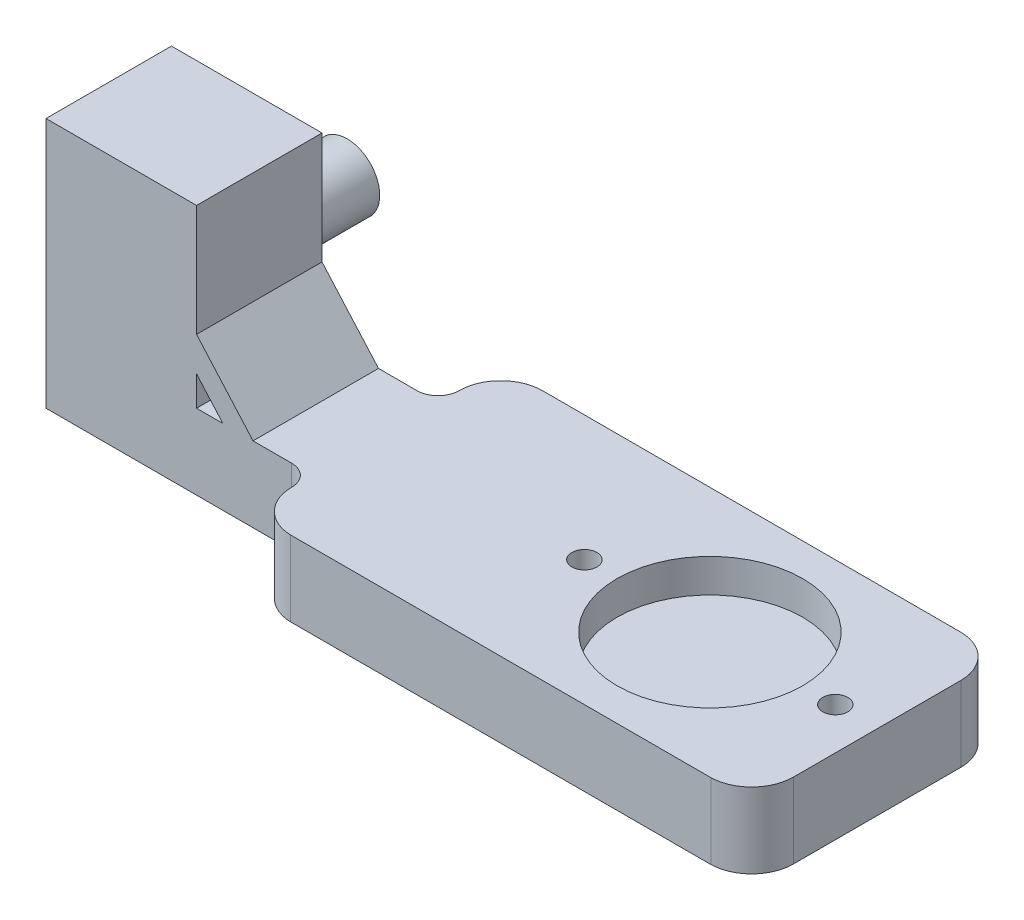
ISO-10303-21;
HEADER;
FILE_DESCRIPTION(('STEP AP214'),'2;1');
FILE_NAME('part.step','',(''),(''),'','','');
FILE_SCHEMA(('AUTOMOTIVE_DESIGN { 1 0 10303 214 1 1 1 1 }'));
ENDSEC;
DATA;
#1=APPLICATION_CONTEXT('core data for automotive mechanical design processes');
#2=APPLICATION_PROTOCOL_DEFINITION('international standard','automotive_design',2000,#1);
#3=PRODUCT_CONTEXT('',#1,'mechanical');
#4=PRODUCT('Part','Part','',(#3));
#5=PRODUCT_RELATED_PRODUCT_CATEGORY('part','',(#4));
#6=PRODUCT_DEFINITION_FORMATION('','',#4);
#7=PRODUCT_DEFINITION_CONTEXT('part definition',#1,'design');
#8=PRODUCT_DEFINITION('design','',#6,#7);
#9=PRODUCT_DEFINITION_SHAPE('','',#8);
#10=(LENGTH_UNIT() NAMED_UNIT(*) SI_UNIT(.MILLI.,.METRE.));
#11=(NAMED_UNIT(*) PLANE_ANGLE_UNIT() SI_UNIT($,.RADIAN.));
#12=(NAMED_UNIT(*) SI_UNIT($,.STERADIAN.) SOLID_ANGLE_UNIT());
#13=UNCERTAINTY_MEASURE_WITH_UNIT(LENGTH_MEASURE(1.E-05),#10,'distance_accuracy_value','');
#14=(GEOMETRIC_REPRESENTATION_CONTEXT(3) GLOBAL_UNCERTAINTY_ASSIGNED_CONTEXT((#13)) GLOBAL_UNIT_ASSIGNED_CONTEXT((#10,
#11,#12)) REPRESENTATION_CONTEXT('',''));
#15=CARTESIAN_POINT('',(0.,0.,0.));
#16=DIRECTION('',(0.,0.,1.));
#17=DIRECTION('',(1.,0.,0.));
#18=AXIS2_PLACEMENT_3D('',#15,#16,#17);
#19=CARTESIAN_POINT('',(25.,9.,-6.35094788103962));
#20=DIRECTION('',(0.,-1.,0.));
#21=DIRECTION('',(0.,0.,-1.));
#22=AXIS2_PLACEMENT_3D('',#19,#20,#21);
#23=PLANE('',#22);
#24=CARTESIAN_POINT('',(10.,9.,3.64978557505112));
#25=DIRECTION('',(0.,1.,0.));
#26=DIRECTION('',(0.,0.,1.));
#27=AXIS2_PLACEMENT_3D('',#24,#25,#26);
#28=CIRCLE('',#27,11.1);
#29=CARTESIAN_POINT('',(10.,9.,14.7497855750511));
#30=VERTEX_POINT('',#29);
#31=EDGE_CURVE('E200',#30,#30,#28,.T.);
#32=ORIENTED_EDGE('',*,*,#31,.F.);
#33=EDGE_LOOP('',(#32));
#34=FACE_BOUND('',#33,.T.);
#35=CARTESIAN_POINT('',(-5.,9.,3.64978557505112));
#36=DIRECTION('',(0.,1.,0.));
#37=DIRECTION('',(0.,0.,1.));
#38=AXIS2_PLACEMENT_3D('',#35,#36,#37);
#39=CIRCLE('',#38,1.5);
#40=CARTESIAN_POINT('',(-5.,9.,5.14978557505112));
#41=VERTEX_POINT('',#40);
#42=EDGE_CURVE('E201',#41,#41,#39,.T.);
#43=ORIENTED_EDGE('',*,*,#42,.F.);
#44=EDGE_LOOP('',(#43));
#45=FACE_BOUND('',#44,.T.);
#46=CARTESIAN_POINT('',(25.,9.,3.64978557505112));
#47=DIRECTION('',(0.,1.,0.));
#48=DIRECTION('',(0.,0.,1.));
#49=AXIS2_PLACEMENT_3D('',#46,#47,#48);
#50=CIRCLE('',#49,1.5);
#51=CARTESIAN_POINT('',(25.,9.,5.14978557505112));
#52=VERTEX_POINT('',#51);
#53=EDGE_CURVE('E196',#52,#52,#50,.T.);
#54=ORIENTED_EDGE('',*,*,#53,.F.);
#55=EDGE_LOOP('',(#54));
#56=FACE_BOUND('',#55,.T.);
#57=DIRECTION('',(-1.,0.,0.));
#58=VECTOR('',#57,1.);
#59=CARTESIAN_POINT('',(-32.5,9.,-3.85094788103961));
#60=LINE('',#59,#58);
#61=CARTESIAN_POINT('',(-32.5,9.,-3.85094788103962));
#62=VERTEX_POINT('',#61);
#63=CARTESIAN_POINT('',(-37.1155749992444,9.,-3.85094788103961));
#64=VERTEX_POINT('',#63);
#65=EDGE_CURVE('E226',#62,#64,#60,.T.);
#66=ORIENTED_EDGE('',*,*,#65,.T.);
#67=DIRECTION('',(0.,0.,1.));
#68=VECTOR('',#67,1.);
#69=CARTESIAN_POINT('',(-37.1155749992444,9.,-14.054359027602));
#70=LINE('',#69,#68);
#71=CARTESIAN_POINT('',(-37.1155749992444,9.,11.1490521189604));
#72=VERTEX_POINT('',#71);
#73=EDGE_CURVE('E50',#64,#72,#70,.T.);
#74=ORIENTED_EDGE('',*,*,#73,.T.);
#75=DIRECTION('',(1.,0.,0.));
#76=VECTOR('',#75,1.);
#77=CARTESIAN_POINT('',(-43.8692131778856,9.,11.1490521189604));
#78=LINE('',#77,#76);
#79=CARTESIAN_POINT('',(-32.4999995696337,9.,11.1490521189604));
#80=VERTEX_POINT('',#79);
#81=EDGE_CURVE('E230',#72,#80,#78,.T.);
#82=ORIENTED_EDGE('',*,*,#81,.T.);
#83=CARTESIAN_POINT('',(-32.4999995696337,9.,13.6490521189604));
#84=DIRECTION('',(0.,-1.,0.));
#85=DIRECTION('',(0.,0.,-1.));
#86=AXIS2_PLACEMENT_3D('',#83,#84,#85);
#87=CIRCLE('',#86,2.5);
#88=CARTESIAN_POINT('',(-30.,9.,13.6505190311419));
#89=VERTEX_POINT('',#88);
#90=EDGE_CURVE('E232',#80,#89,#87,.T.);
#91=ORIENTED_EDGE('',*,*,#90,.T.);
#92=CARTESIAN_POINT('',(-25.,9.,13.6505190311419));
#93=DIRECTION('',(0.,1.,0.));
#94=DIRECTION('',(0.,0.,1.));
#95=AXIS2_PLACEMENT_3D('',#92,#93,#94);
#96=CIRCLE('',#95,5.);
#97=CARTESIAN_POINT('',(-25.121107266436,9.,18.6490521189604));
#98=VERTEX_POINT('',#97);
#99=EDGE_CURVE('E234',#89,#98,#96,.T.);
#100=ORIENTED_EDGE('',*,*,#99,.T.);
#101=DIRECTION('',(1.,0.,0.));
#102=VECTOR('',#101,1.);
#103=CARTESIAN_POINT('',(25.121107266436,9.,18.6490521189604));
#104=LINE('',#103,#102);
#105=CARTESIAN_POINT('',(25.121107266436,9.,18.6490521189604));
#106=VERTEX_POINT('',#105);
#107=EDGE_CURVE('E236',#98,#106,#104,.T.);
#108=ORIENTED_EDGE('',*,*,#107,.T.);
#109=CARTESIAN_POINT('',(25.,9.,13.6505190311419));
#110=DIRECTION('',(0.,1.,0.));
#111=DIRECTION('',(0.,0.,-1.));
#112=AXIS2_PLACEMENT_3D('',#109,#110,#111);
#113=CIRCLE('',#112,5.);
#114=CARTESIAN_POINT('',(30.,9.,13.6505190311419));
#115=VERTEX_POINT('',#114);
#116=EDGE_CURVE('E238',#106,#115,#113,.T.);
#117=ORIENTED_EDGE('',*,*,#116,.T.);
#118=DIRECTION('',(0.,0.,-1.));
#119=VECTOR('',#118,1.);
#120=CARTESIAN_POINT('',(30.,9.,-6.35094788103962));
#121=LINE('',#120,#119);
#122=CARTESIAN_POINT('',(30.,9.,-6.35094788103962));
#123=VERTEX_POINT('',#122);
#124=EDGE_CURVE('E240',#115,#123,#121,.T.);
#125=ORIENTED_EDGE('',*,*,#124,.T.);
#126=CARTESIAN_POINT('',(25.,9.,-6.35094788103962));
#127=DIRECTION('',(0.,1.,0.));
#128=DIRECTION('',(0.,0.,-1.));
#129=AXIS2_PLACEMENT_3D('',#126,#127,#128);
#130=CIRCLE('',#129,5.00000000000001);
#131=CARTESIAN_POINT('',(25.,9.,-11.3509478810396));
#132=VERTEX_POINT('',#131);
#133=EDGE_CURVE('E215',#123,#132,#130,.T.);
#134=ORIENTED_EDGE('',*,*,#133,.T.);
#135=DIRECTION('',(-1.,0.,0.));
#136=VECTOR('',#135,1.);
#137=CARTESIAN_POINT('',(-25.,9.,-11.3509478810396));
#138=LINE('',#137,#136);
#139=CARTESIAN_POINT('',(-25.,9.,-11.3509478810396));
#140=VERTEX_POINT('',#139);
#141=EDGE_CURVE('E218',#132,#140,#138,.T.);
#142=ORIENTED_EDGE('',*,*,#141,.T.);
#143=CARTESIAN_POINT('',(-25.,9.,-6.35094788103961));
#144=DIRECTION('',(0.,1.,0.));
#145=DIRECTION('',(0.,0.,1.));
#146=AXIS2_PLACEMENT_3D('',#143,#144,#145);
#147=CIRCLE('',#146,5.00000000000001);
#148=CARTESIAN_POINT('',(-30.,9.,-6.35094788103961));
#149=VERTEX_POINT('',#148);
#150=EDGE_CURVE('E221',#140,#149,#147,.T.);
#151=ORIENTED_EDGE('',*,*,#150,.T.);
#152=CARTESIAN_POINT('',(-32.5,9.,-6.35094788103961));
#153=DIRECTION('',(0.,-1.,0.));
#154=DIRECTION('',(0.,0.,-1.));
#155=AXIS2_PLACEMENT_3D('',#152,#153,#154);
#156=CIRCLE('',#155,2.5);
#157=EDGE_CURVE('E223',#149,#62,#156,.T.);
#158=ORIENTED_EDGE('',*,*,#157,.T.);
#159=EDGE_LOOP('',(#66,#74,#82,#91,#100,#108,#117,#125,#134,#142,#151,#158));
#160=FACE_BOUND('',#159,.T.);
#161=ADVANCED_FACE('F35',(#34,#45,#56,#160),#23,.F.);
#162=CARTESIAN_POINT('',(-43.8692131778856,30.,0.));
#163=DIRECTION('',(-1.,0.,0.));
#164=DIRECTION('',(0.,0.,1.));
#165=AXIS2_PLACEMENT_3D('',#162,#163,#164);
#166=PLANE('',#165);
#167=DIRECTION('',(0.,-1.,0.));
#168=VECTOR('',#167,1.);
#169=CARTESIAN_POINT('',(-43.8692131778856,30.,11.1490521189604));
#170=LINE('',#169,#168);
#171=CARTESIAN_POINT('',(-43.8692131778856,30.,11.1490521189604));
#172=VERTEX_POINT('',#171);
#173=CARTESIAN_POINT('',(-43.8692131778856,16.648396588684,11.1490521189604));
#174=VERTEX_POINT('',#173);
#175=EDGE_CURVE('E182',#172,#174,#170,.T.);
#176=ORIENTED_EDGE('',*,*,#175,.T.);
#177=DIRECTION('',(0.,0.,1.));
#178=VECTOR('',#177,1.);
#179=CARTESIAN_POINT('',(-43.8692131778856,16.648396588684,-14.054359027602));
#180=LINE('',#179,#178);
#181=CARTESIAN_POINT('',(-43.8692131778856,16.648396588684,-3.85094788103961));
#182=VERTEX_POINT('',#181);
#183=EDGE_CURVE('E363',#182,#174,#180,.T.);
#184=ORIENTED_EDGE('',*,*,#183,.F.);
#185=DIRECTION('',(0.,-1.,0.));
#186=VECTOR('',#185,1.);
#187=CARTESIAN_POINT('',(-43.8692131778856,30.,-3.85094788103961));
#188=LINE('',#187,#186);
#189=CARTESIAN_POINT('',(-43.8692131778856,30.,-3.85094788103961));
#190=VERTEX_POINT('',#189);
#191=EDGE_CURVE('E183',#190,#182,#188,.T.);
#192=ORIENTED_EDGE('',*,*,#191,.F.);
#193=DIRECTION('',(0.,0.,-1.));
#194=VECTOR('',#193,1.);
#195=CARTESIAN_POINT('',(-43.8692131778856,30.,0.));
#196=LINE('',#195,#194);
#197=EDGE_CURVE('E357',#172,#190,#196,.T.);
#198=ORIENTED_EDGE('',*,*,#197,.F.);
#199=EDGE_LOOP('',(#176,#184,#192,#198));
#200=FACE_BOUND('',#199,.T.);
#201=ADVANCED_FACE('F392',(#200),#166,.F.);
#202=CARTESIAN_POINT('',(25.,9.,-6.35094788103962));
#203=DIRECTION('',(0.,-1.,0.));
#204=DIRECTION('',(0.,0.,-1.));
#205=AXIS2_PLACEMENT_3D('',#202,#203,#204);
#206=CYLINDRICAL_SURFACE('',#205,5.00000000000001);
#207=CARTESIAN_POINT('',(25.,0.,-6.35094788103962));
#208=DIRECTION('',(0.,1.,0.));
#209=DIRECTION('',(0.,0.,-1.));
#210=AXIS2_PLACEMENT_3D('',#207,#208,#209);
#211=CIRCLE('',#210,5.00000000000001);
#212=CARTESIAN_POINT('',(30.,0.,-6.35094788103962));
#213=VERTEX_POINT('',#212);
#214=CARTESIAN_POINT('',(25.,0.,-11.3509478810396));
#215=VERTEX_POINT('',#214);
#216=EDGE_CURVE('E212',#213,#215,#211,.T.);
#217=ORIENTED_EDGE('',*,*,#216,.T.);
#218=DIRECTION('',(0.,-1.,0.));
#219=VECTOR('',#218,1.);
#220=CARTESIAN_POINT('',(25.,9.,-11.3509478810396));
#221=LINE('',#220,#219);
#222=EDGE_CURVE('E43',#132,#215,#221,.T.);
#223=ORIENTED_EDGE('',*,*,#222,.F.);
#224=ORIENTED_EDGE('',*,*,#133,.F.);
#225=DIRECTION('',(0.,-1.,0.));
#226=VECTOR('',#225,1.);
#227=CARTESIAN_POINT('',(30.,9.,-6.35094788103962));
#228=LINE('',#227,#226);
#229=EDGE_CURVE('E242',#123,#213,#228,.T.);
#230=ORIENTED_EDGE('',*,*,#229,.T.);
#231=EDGE_LOOP('',(#217,#223,#224,#230));
#232=FACE_BOUND('',#231,.T.);
#233=ADVANCED_FACE('F37',(#232),#206,.T.);
#234=CARTESIAN_POINT('',(-25.,9.,-11.3509478810396));
#235=DIRECTION('',(0.,0.,1.));
#236=DIRECTION('',(1.,0.,0.));
#237=AXIS2_PLACEMENT_3D('',#234,#235,#236);
#238=PLANE('',#237);
#239=DIRECTION('',(-1.,0.,0.));
#240=VECTOR('',#239,1.);
#241=CARTESIAN_POINT('',(-25.,0.,-11.3509478810396));
#242=LINE('',#241,#240);
#243=CARTESIAN_POINT('',(-25.,0.,-11.3509478810396));
#244=VERTEX_POINT('',#243);
#245=EDGE_CURVE('E245',#215,#244,#242,.T.);
#246=ORIENTED_EDGE('',*,*,#245,.T.);
#247=DIRECTION('',(0.,-1.,0.));
#248=VECTOR('',#247,1.);
#249=CARTESIAN_POINT('',(-25.,9.,-11.3509478810396));
#250=LINE('',#249,#248);
#251=EDGE_CURVE('E287',#140,#244,#250,.T.);
#252=ORIENTED_EDGE('',*,*,#251,.F.);
#253=ORIENTED_EDGE('',*,*,#141,.F.);
#254=ORIENTED_EDGE('',*,*,#222,.T.);
#255=EDGE_LOOP('',(#246,#252,#253,#254));
#256=FACE_BOUND('',#255,.T.);
#257=ADVANCED_FACE('F292',(#256),#238,.F.);
#258=CARTESIAN_POINT('',(-25.,9.,-6.35094788103961));
#259=DIRECTION('',(0.,-1.,0.));
#260=DIRECTION('',(0.,0.,-1.));
#261=AXIS2_PLACEMENT_3D('',#258,#259,#260);
#262=CYLINDRICAL_SURFACE('',#261,5.00000000000001);
#263=CARTESIAN_POINT('',(-25.,0.,-6.35094788103961));
#264=DIRECTION('',(0.,1.,0.));
#265=DIRECTION('',(0.,0.,1.));
#266=AXIS2_PLACEMENT_3D('',#263,#264,#265);
#267=CIRCLE('',#266,5.00000000000001);
#268=CARTESIAN_POINT('',(-30.,0.,-6.35094788103961));
#269=VERTEX_POINT('',#268);
#270=EDGE_CURVE('E247',#244,#269,#267,.T.);
#271=ORIENTED_EDGE('',*,*,#270,.T.);
#272=DIRECTION('',(0.,-1.,0.));
#273=VECTOR('',#272,1.);
#274=CARTESIAN_POINT('',(-30.,9.,-6.35094788103961));
#275=LINE('',#274,#273);
#276=EDGE_CURVE('E284',#149,#269,#275,.T.);
#277=ORIENTED_EDGE('',*,*,#276,.F.);
#278=ORIENTED_EDGE('',*,*,#150,.F.);
#279=ORIENTED_EDGE('',*,*,#251,.T.);
#280=EDGE_LOOP('',(#271,#277,#278,#279));
#281=FACE_BOUND('',#280,.T.);
#282=ADVANCED_FACE('F307',(#281),#262,.T.);
#283=CARTESIAN_POINT('',(-32.5,9.,-6.35094788103961));
#284=DIRECTION('',(0.,-1.,0.));
#285=DIRECTION('',(0.,0.,-1.));
#286=AXIS2_PLACEMENT_3D('',#283,#284,#285);
#287=CYLINDRICAL_SURFACE('',#286,2.5);
#288=CARTESIAN_POINT('',(-32.5,0.,-6.35094788103961));
#289=DIRECTION('',(0.,-1.,0.));
#290=DIRECTION('',(0.,0.,-1.));
#291=AXIS2_PLACEMENT_3D('',#288,#289,#290);
#292=CIRCLE('',#291,2.5);
#293=CARTESIAN_POINT('',(-32.5,0.,-3.85094788103962));
#294=VERTEX_POINT('',#293);
#295=EDGE_CURVE('E249',#269,#294,#292,.T.);
#296=ORIENTED_EDGE('',*,*,#295,.T.);
#297=DIRECTION('',(0.,-1.,0.));
#298=VECTOR('',#297,1.);
#299=CARTESIAN_POINT('',(-32.5,9.,-3.85094788103962));
#300=LINE('',#299,#298);
#301=EDGE_CURVE('E281',#62,#294,#300,.T.);
#302=ORIENTED_EDGE('',*,*,#301,.F.);
#303=ORIENTED_EDGE('',*,*,#157,.F.);
#304=ORIENTED_EDGE('',*,*,#276,.T.);
#305=EDGE_LOOP('',(#296,#302,#303,#304));
#306=FACE_BOUND('',#305,.T.);
#307=ADVANCED_FACE('F311',(#306),#287,.F.);
#308=CARTESIAN_POINT('',(-32.5,9.,-3.85094788103961));
#309=DIRECTION('',(0.,0.,1.));
#310=DIRECTION('',(1.,0.,0.));
#311=AXIS2_PLACEMENT_3D('',#308,#309,#310);
#312=PLANE('',#311);
#313=CARTESIAN_POINT('',(-52.8692131778856,15.,-3.85094788103961));
#314=DIRECTION('',(0.,0.,1.));
#315=DIRECTION('',(1.,0.,0.));
#316=AXIS2_PLACEMENT_3D('',#313,#314,#315);
#317=CIRCLE('',#316,3.9);
#318=CARTESIAN_POINT('',(-48.9692131778856,15.,-3.85094788103961));
#319=VERTEX_POINT('',#318);
#320=EDGE_CURVE('E11',#319,#319,#317,.F.);
#321=ORIENTED_EDGE('',*,*,#320,.F.);
#322=EDGE_LOOP('',(#321));
#323=FACE_BOUND('',#322,.T.);
#324=CARTESIAN_POINT('',(-40.7270082344223,9.,-3.85094788103962));
#325=VERTEX_POINT('',#324);
#326=CARTESIAN_POINT('',(-43.8692131778856,9.,-3.85094788103961));
#327=VERTEX_POINT('',#326);
#328=EDGE_CURVE('E225',#325,#327,#60,.T.);
#329=ORIENTED_EDGE('',*,*,#328,.F.);
#330=DIRECTION('',(-0.661900033393888,0.749592119617843,0.));
#331=VECTOR('',#330,1.);
#332=CARTESIAN_POINT('',(-43.8692131778856,12.5585012011061,-3.85094788103961));
#333=LINE('',#332,#331);
#334=CARTESIAN_POINT('',(-43.8692131778856,12.5585012011061,-3.85094788103961));
#335=VERTEX_POINT('',#334);
#336=EDGE_CURVE('E350',#325,#335,#333,.T.);
#337=ORIENTED_EDGE('',*,*,#336,.T.);
#338=EDGE_CURVE('E179',#335,#327,#188,.T.);
#339=ORIENTED_EDGE('',*,*,#338,.T.);
#340=EDGE_LOOP('',(#329,#337,#339));
#341=FACE_BOUND('',#340,.T.);
#342=DIRECTION('',(-1.,0.,0.));
#343=VECTOR('',#342,1.);
#344=CARTESIAN_POINT('',(-32.5,0.,-3.85094788103961));
#345=LINE('',#344,#343);
#346=CARTESIAN_POINT('',(-61.8692131778856,0.,-3.85094788103961));
#347=VERTEX_POINT('',#346);
#348=EDGE_CURVE('E251',#294,#347,#345,.T.);
#349=ORIENTED_EDGE('',*,*,#348,.T.);
#350=DIRECTION('',(0.,-1.,0.));
#351=VECTOR('',#350,1.);
#352=CARTESIAN_POINT('',(-61.8692131778856,30.,-3.85094788103961));
#353=LINE('',#352,#351);
#354=CARTESIAN_POINT('',(-61.8692131778856,30.,-3.85094788103961));
#355=VERTEX_POINT('',#354);
#356=EDGE_CURVE('E193',#355,#347,#353,.T.);
#357=ORIENTED_EDGE('',*,*,#356,.F.);
#358=DIRECTION('',(1.,0.,0.));
#359=VECTOR('',#358,1.);
#360=CARTESIAN_POINT('',(0.,30.,-3.85094788103961));
#361=LINE('',#360,#359);
#362=EDGE_CURVE('E349',#355,#190,#361,.T.);
#363=ORIENTED_EDGE('',*,*,#362,.T.);
#364=ORIENTED_EDGE('',*,*,#191,.T.);
#365=DIRECTION('',(0.661900033393888,-0.749592119617843,0.));
#366=VECTOR('',#365,1.);
#367=CARTESIAN_POINT('',(-37.1155749992444,9.,-3.85094788103961));
#368=LINE('',#367,#366);
#369=EDGE_CURVE('E354',#182,#64,#368,.T.);
#370=ORIENTED_EDGE('',*,*,#369,.T.);
#371=ORIENTED_EDGE('',*,*,#65,.F.);
#372=ORIENTED_EDGE('',*,*,#301,.T.);
#373=EDGE_LOOP('',(#349,#357,#363,#364,#370,#371,#372));
#374=FACE_BOUND('',#373,.T.);
#375=ADVANCED_FACE('F379',(#323,#341,#374),#312,.F.);
#376=CARTESIAN_POINT('',(-43.8692131778856,9.,11.1490521189604));
#377=DIRECTION('',(0.,0.,-1.));
#378=DIRECTION('',(-1.,0.,0.));
#379=AXIS2_PLACEMENT_3D('',#376,#377,#378);
#380=PLANE('',#379);
#381=ORIENTED_EDGE('',*,*,#81,.F.);
#382=DIRECTION('',(-0.661900033393888,0.749592119617843,0.));
#383=VECTOR('',#382,1.);
#384=CARTESIAN_POINT('',(-37.1155749992444,9.,11.1490521189604));
#385=LINE('',#384,#383);
#386=EDGE_CURVE('E170',#72,#174,#385,.T.);
#387=ORIENTED_EDGE('',*,*,#386,.T.);
#388=ORIENTED_EDGE('',*,*,#175,.F.);
#389=DIRECTION('',(1.,0.,0.));
#390=VECTOR('',#389,1.);
#391=CARTESIAN_POINT('',(0.,30.,11.1490521189604));
#392=LINE('',#391,#390);
#393=CARTESIAN_POINT('',(-61.8692131778856,30.,11.1490521189604));
#394=VERTEX_POINT('',#393);
#395=EDGE_CURVE('E344',#394,#172,#392,.T.);
#396=ORIENTED_EDGE('',*,*,#395,.F.);
#397=DIRECTION('',(0.,-1.,0.));
#398=VECTOR('',#397,1.);
#399=CARTESIAN_POINT('',(-61.8692131778856,30.,11.1490521189604));
#400=LINE('',#399,#398);
#401=CARTESIAN_POINT('',(-61.8692131778856,0.,11.1490521189604));
#402=VERTEX_POINT('',#401);
#403=EDGE_CURVE('E186',#394,#402,#400,.T.);
#404=ORIENTED_EDGE('',*,*,#403,.T.);
#405=DIRECTION('',(1.,0.,0.));
#406=VECTOR('',#405,1.);
#407=CARTESIAN_POINT('',(-43.8692131778856,0.,11.1490521189604));
#408=LINE('',#407,#406);
#409=CARTESIAN_POINT('',(-32.4999995696337,0.,11.1490521189604));
#410=VERTEX_POINT('',#409);
#411=EDGE_CURVE('E253',#402,#410,#408,.T.);
#412=ORIENTED_EDGE('',*,*,#411,.T.);
#413=DIRECTION('',(0.,-1.,0.));
#414=VECTOR('',#413,1.);
#415=CARTESIAN_POINT('',(-32.4999995696337,9.,11.1490521189604));
#416=LINE('',#415,#414);
#417=EDGE_CURVE('E278',#80,#410,#416,.T.);
#418=ORIENTED_EDGE('',*,*,#417,.F.);
#419=EDGE_LOOP('',(#381,#387,#388,#396,#404,#412,#418));
#420=FACE_BOUND('',#419,.T.);
#421=DIRECTION('',(0.661900033393888,-0.749592119617843,0.));
#422=VECTOR('',#421,1.);
#423=CARTESIAN_POINT('',(-43.8692131778856,12.5585012011061,11.1490521189604));
#424=LINE('',#423,#422);
#425=CARTESIAN_POINT('',(-43.8692131778856,12.5585012011061,11.1490521189604));
#426=VERTEX_POINT('',#425);
#427=CARTESIAN_POINT('',(-40.7270082344223,9.,11.1490521189604));
#428=VERTEX_POINT('',#427);
#429=EDGE_CURVE('E161',#426,#428,#424,.T.);
#430=ORIENTED_EDGE('',*,*,#429,.T.);
#431=CARTESIAN_POINT('',(-43.8692131778856,9.,11.1490521189604));
#432=VERTEX_POINT('',#431);
#433=EDGE_CURVE('E58',#432,#428,#78,.T.);
#434=ORIENTED_EDGE('',*,*,#433,.F.);
#435=EDGE_CURVE('E177',#426,#432,#170,.T.);
#436=ORIENTED_EDGE('',*,*,#435,.F.);
#437=EDGE_LOOP('',(#430,#434,#436));
#438=FACE_BOUND('',#437,.T.);
#439=ADVANCED_FACE('F181',(#420,#438),#380,.F.);
#440=CARTESIAN_POINT('',(-32.4999995696337,9.,13.6490521189604));
#441=DIRECTION('',(0.,-1.,0.));
#442=DIRECTION('',(0.,0.,-1.));
#443=AXIS2_PLACEMENT_3D('',#440,#441,#442);
#444=CYLINDRICAL_SURFACE('',#443,2.5);
#445=CARTESIAN_POINT('',(-32.4999995696337,0.,13.6490521189604));
#446=DIRECTION('',(0.,-1.,0.));
#447=DIRECTION('',(0.,0.,-1.));
#448=AXIS2_PLACEMENT_3D('',#445,#446,#447);
#449=CIRCLE('',#448,2.5);
#450=CARTESIAN_POINT('',(-30.,0.,13.6505190311419));
#451=VERTEX_POINT('',#450);
#452=EDGE_CURVE('E255',#410,#451,#449,.T.);
#453=ORIENTED_EDGE('',*,*,#452,.T.);
#454=DIRECTION('',(0.,-1.,0.));
#455=VECTOR('',#454,1.);
#456=CARTESIAN_POINT('',(-30.,9.,13.6505190311419));
#457=LINE('',#456,#455);
#458=EDGE_CURVE('E275',#89,#451,#457,.T.);
#459=ORIENTED_EDGE('',*,*,#458,.F.);
#460=ORIENTED_EDGE('',*,*,#90,.F.);
#461=ORIENTED_EDGE('',*,*,#417,.T.);
#462=EDGE_LOOP('',(#453,#459,#460,#461));
#463=FACE_BOUND('',#462,.T.);
#464=ADVANCED_FACE('F336',(#463),#444,.F.);
#465=CARTESIAN_POINT('',(-25.,9.,13.6505190311419));
#466=DIRECTION('',(0.,-1.,0.));
#467=DIRECTION('',(0.,0.,-1.));
#468=AXIS2_PLACEMENT_3D('',#465,#466,#467);
#469=CYLINDRICAL_SURFACE('',#468,5.);
#470=CARTESIAN_POINT('',(-25.,0.,13.6505190311419));
#471=DIRECTION('',(0.,1.,0.));
#472=DIRECTION('',(0.,0.,1.));
#473=AXIS2_PLACEMENT_3D('',#470,#471,#472);
#474=CIRCLE('',#473,5.);
#475=CARTESIAN_POINT('',(-25.121107266436,0.,18.6490521189604));
#476=VERTEX_POINT('',#475);
#477=EDGE_CURVE('E257',#451,#476,#474,.T.);
#478=ORIENTED_EDGE('',*,*,#477,.T.);
#479=DIRECTION('',(0.,-1.,0.));
#480=VECTOR('',#479,1.);
#481=CARTESIAN_POINT('',(-25.121107266436,9.,18.6490521189604));
#482=LINE('',#481,#480);
#483=EDGE_CURVE('E272',#98,#476,#482,.T.);
#484=ORIENTED_EDGE('',*,*,#483,.F.);
#485=ORIENTED_EDGE('',*,*,#99,.F.);
#486=ORIENTED_EDGE('',*,*,#458,.T.);
#487=EDGE_LOOP('',(#478,#484,#485,#486));
#488=FACE_BOUND('',#487,.T.);
#489=ADVANCED_FACE('F332',(#488),#469,.T.);
#490=CARTESIAN_POINT('',(25.121107266436,9.,18.6490521189604));
#491=DIRECTION('',(0.,0.,-1.));
#492=DIRECTION('',(-1.,0.,0.));
#493=AXIS2_PLACEMENT_3D('',#490,#491,#492);
#494=PLANE('',#493);
#495=DIRECTION('',(1.,0.,0.));
#496=VECTOR('',#495,1.);
#497=CARTESIAN_POINT('',(25.121107266436,0.,18.6490521189604));
#498=LINE('',#497,#496);
#499=CARTESIAN_POINT('',(25.121107266436,0.,18.6490521189604));
#500=VERTEX_POINT('',#499);
#501=EDGE_CURVE('E259',#476,#500,#498,.T.);
#502=ORIENTED_EDGE('',*,*,#501,.T.);
#503=DIRECTION('',(0.,-1.,0.));
#504=VECTOR('',#503,1.);
#505=CARTESIAN_POINT('',(25.121107266436,9.,18.6490521189604));
#506=LINE('',#505,#504);
#507=EDGE_CURVE('E269',#106,#500,#506,.T.);
#508=ORIENTED_EDGE('',*,*,#507,.F.);
#509=ORIENTED_EDGE('',*,*,#107,.F.);
#510=ORIENTED_EDGE('',*,*,#483,.T.);
#511=EDGE_LOOP('',(#502,#508,#509,#510));
#512=FACE_BOUND('',#511,.T.);
#513=ADVANCED_FACE('F327',(#512),#494,.F.);
#514=CARTESIAN_POINT('',(25.,9.,13.6505190311419));
#515=DIRECTION('',(0.,-1.,0.));
#516=DIRECTION('',(0.,0.,-1.));
#517=AXIS2_PLACEMENT_3D('',#514,#515,#516);
#518=CYLINDRICAL_SURFACE('',#517,5.);
#519=CARTESIAN_POINT('',(25.,0.,13.6505190311419));
#520=DIRECTION('',(0.,1.,0.));
#521=DIRECTION('',(0.,0.,-1.));
#522=AXIS2_PLACEMENT_3D('',#519,#520,#521);
#523=CIRCLE('',#522,5.);
#524=CARTESIAN_POINT('',(30.,0.,13.6505190311419));
#525=VERTEX_POINT('',#524);
#526=EDGE_CURVE('E261',#500,#525,#523,.T.);
#527=ORIENTED_EDGE('',*,*,#526,.T.);
#528=DIRECTION('',(0.,-1.,0.));
#529=VECTOR('',#528,1.);
#530=CARTESIAN_POINT('',(30.,9.,13.6505190311419));
#531=LINE('',#530,#529);
#532=EDGE_CURVE('E266',#115,#525,#531,.T.);
#533=ORIENTED_EDGE('',*,*,#532,.F.);
#534=ORIENTED_EDGE('',*,*,#116,.F.);
#535=ORIENTED_EDGE('',*,*,#507,.T.);
#536=EDGE_LOOP('',(#527,#533,#534,#535));
#537=FACE_BOUND('',#536,.T.);
#538=ADVANCED_FACE('F321',(#537),#518,.T.);
#539=CARTESIAN_POINT('',(30.,9.,-6.35094788103962));
#540=DIRECTION('',(-1.,0.,0.));
#541=DIRECTION('',(0.,0.,1.));
#542=AXIS2_PLACEMENT_3D('',#539,#540,#541);
#543=PLANE('',#542);
#544=DIRECTION('',(0.,0.,-1.));
#545=VECTOR('',#544,1.);
#546=CARTESIAN_POINT('',(30.,0.,-6.35094788103962));
#547=LINE('',#546,#545);
#548=EDGE_CURVE('E219',#525,#213,#547,.T.);
#549=ORIENTED_EDGE('',*,*,#548,.T.);
#550=ORIENTED_EDGE('',*,*,#229,.F.);
#551=ORIENTED_EDGE('',*,*,#124,.F.);
#552=ORIENTED_EDGE('',*,*,#532,.T.);
#553=EDGE_LOOP('',(#549,#550,#551,#552));
#554=FACE_BOUND('',#553,.T.);
#555=ADVANCED_FACE('F319',(#554),#543,.F.);
#556=ORIENTED_EDGE('',*,*,#433,.T.);
#557=DIRECTION('',(0.,0.,1.));
#558=VECTOR('',#557,1.);
#559=CARTESIAN_POINT('',(-40.7270082344223,9.,-14.054359027602));
#560=LINE('',#559,#558);
#561=EDGE_CURVE('E167',#325,#428,#560,.T.);
#562=ORIENTED_EDGE('',*,*,#561,.F.);
#563=ORIENTED_EDGE('',*,*,#328,.T.);
#564=DIRECTION('',(0.,0.,1.));
#565=VECTOR('',#564,1.);
#566=CARTESIAN_POINT('',(-43.8692131778856,9.,-3.85094788103961));
#567=LINE('',#566,#565);
#568=EDGE_CURVE('E228',#327,#432,#567,.T.);
#569=ORIENTED_EDGE('',*,*,#568,.T.);
#570=EDGE_LOOP('',(#556,#562,#563,#569));
#571=FACE_BOUND('',#570,.T.);
#572=ADVANCED_FACE('F407',(#571),#23,.F.);
#573=CARTESIAN_POINT('',(25.,0.,-6.35094788103962));
#574=DIRECTION('',(0.,-1.,0.));
#575=DIRECTION('',(0.,0.,-1.));
#576=AXIS2_PLACEMENT_3D('',#573,#574,#575);
#577=PLANE('',#576);
#578=ORIENTED_EDGE('',*,*,#216,.F.);
#579=ORIENTED_EDGE('',*,*,#548,.F.);
#580=ORIENTED_EDGE('',*,*,#526,.F.);
#581=ORIENTED_EDGE('',*,*,#501,.F.);
#582=ORIENTED_EDGE('',*,*,#477,.F.);
#583=ORIENTED_EDGE('',*,*,#452,.F.);
#584=ORIENTED_EDGE('',*,*,#411,.F.);
#585=DIRECTION('',(0.,0.,-1.));
#586=VECTOR('',#585,1.);
#587=CARTESIAN_POINT('',(-61.8692131778856,0.,0.));
#588=LINE('',#587,#586);
#589=EDGE_CURVE('E340',#402,#347,#588,.T.);
#590=ORIENTED_EDGE('',*,*,#589,.T.);
#591=ORIENTED_EDGE('',*,*,#348,.F.);
#592=ORIENTED_EDGE('',*,*,#295,.F.);
#593=ORIENTED_EDGE('',*,*,#270,.F.);
#594=ORIENTED_EDGE('',*,*,#245,.F.);
#595=EDGE_LOOP('',(#578,#579,#580,#581,#582,#583,#584,#590,#591,#592,#593,#594));
#596=FACE_BOUND('',#595,.T.);
#597=ADVANCED_FACE('F300',(#596),#577,.T.);
#598=CARTESIAN_POINT('',(10.,5.,3.64978557505112));
#599=DIRECTION('',(0.,1.,0.));
#600=DIRECTION('',(0.,0.,1.));
#601=AXIS2_PLACEMENT_3D('',#598,#599,#600);
#602=CYLINDRICAL_SURFACE('',#601,11.1);
#603=CARTESIAN_POINT('',(10.,5.,3.64978557505112));
#604=DIRECTION('',(0.,1.,0.));
#605=DIRECTION('',(0.,0.,1.));
#606=AXIS2_PLACEMENT_3D('',#603,#604,#605);
#607=CIRCLE('',#606,11.1);
#608=CARTESIAN_POINT('',(10.,5.,14.7497855750511));
#609=VERTEX_POINT('',#608);
#610=EDGE_CURVE('E209',#609,#609,#607,.T.);
#611=ORIENTED_EDGE('',*,*,#610,.F.);
#612=EDGE_LOOP('',(#611));
#613=FACE_BOUND('',#612,.T.);
#614=ORIENTED_EDGE('',*,*,#31,.T.);
#615=EDGE_LOOP('',(#614));
#616=FACE_BOUND('',#615,.T.);
#617=ADVANCED_FACE('F420',(#613,#616),#602,.F.);
#618=CARTESIAN_POINT('',(0.,5.,0.));
#619=DIRECTION('',(0.,1.,0.));
#620=DIRECTION('',(0.,0.,1.));
#621=AXIS2_PLACEMENT_3D('',#618,#619,#620);
#622=PLANE('',#621);
#623=ORIENTED_EDGE('',*,*,#610,.T.);
#624=EDGE_LOOP('',(#623));
#625=FACE_BOUND('',#624,.T.);
#626=ADVANCED_FACE('F572',(#625),#622,.T.);
#627=CARTESIAN_POINT('',(-5.,5.,3.64978557505112));
#628=DIRECTION('',(0.,1.,0.));
#629=DIRECTION('',(0.,0.,1.));
#630=AXIS2_PLACEMENT_3D('',#627,#628,#629);
#631=CYLINDRICAL_SURFACE('',#630,1.5);
#632=CARTESIAN_POINT('',(-5.,5.,3.64978557505112));
#633=DIRECTION('',(0.,1.,0.));
#634=DIRECTION('',(0.,0.,1.));
#635=AXIS2_PLACEMENT_3D('',#632,#633,#634);
#636=CIRCLE('',#635,1.5);
#637=CARTESIAN_POINT('',(-5.,5.,5.14978557505112));
#638=VERTEX_POINT('',#637);
#639=EDGE_CURVE('E197',#638,#638,#636,.T.);
#640=ORIENTED_EDGE('',*,*,#639,.F.);
#641=EDGE_LOOP('',(#640));
#642=FACE_BOUND('',#641,.T.);
#643=ORIENTED_EDGE('',*,*,#42,.T.);
#644=EDGE_LOOP('',(#643));
#645=FACE_BOUND('',#644,.T.);
#646=ADVANCED_FACE('F581',(#642,#645),#631,.F.);
#647=CARTESIAN_POINT('',(0.,5.,0.));
#648=DIRECTION('',(0.,1.,0.));
#649=DIRECTION('',(0.,0.,1.));
#650=AXIS2_PLACEMENT_3D('',#647,#648,#649);
#651=PLANE('',#650);
#652=ORIENTED_EDGE('',*,*,#639,.T.);
#653=EDGE_LOOP('',(#652));
#654=FACE_BOUND('',#653,.T.);
#655=ADVANCED_FACE('F591',(#654),#651,.T.);
#656=CARTESIAN_POINT('',(25.,5.,3.64978557505112));
#657=DIRECTION('',(0.,1.,0.));
#658=DIRECTION('',(0.,0.,1.));
#659=AXIS2_PLACEMENT_3D('',#656,#657,#658);
#660=CYLINDRICAL_SURFACE('',#659,1.5);
#661=CARTESIAN_POINT('',(25.,5.,3.64978557505112));
#662=DIRECTION('',(0.,1.,0.));
#663=DIRECTION('',(0.,0.,1.));
#664=AXIS2_PLACEMENT_3D('',#661,#662,#663);
#665=CIRCLE('',#664,1.5);
#666=CARTESIAN_POINT('',(25.,5.,5.14978557505112));
#667=VERTEX_POINT('',#666);
#668=EDGE_CURVE('E204',#667,#667,#665,.T.);
#669=ORIENTED_EDGE('',*,*,#668,.F.);
#670=EDGE_LOOP('',(#669));
#671=FACE_BOUND('',#670,.T.);
#672=ORIENTED_EDGE('',*,*,#53,.T.);
#673=EDGE_LOOP('',(#672));
#674=FACE_BOUND('',#673,.T.);
#675=ADVANCED_FACE('F601',(#671,#674),#660,.F.);
#676=CARTESIAN_POINT('',(0.,5.,0.));
#677=DIRECTION('',(0.,1.,0.));
#678=DIRECTION('',(0.,0.,1.));
#679=AXIS2_PLACEMENT_3D('',#676,#677,#678);
#680=PLANE('',#679);
#681=ORIENTED_EDGE('',*,*,#668,.T.);
#682=EDGE_LOOP('',(#681));
#683=FACE_BOUND('',#682,.T.);
#684=ADVANCED_FACE('F611',(#683),#680,.T.);
#685=CARTESIAN_POINT('',(-61.8692131778856,30.,0.));
#686=DIRECTION('',(-1.,0.,0.));
#687=DIRECTION('',(0.,0.,1.));
#688=AXIS2_PLACEMENT_3D('',#685,#686,#687);
#689=PLANE('',#688);
#690=ORIENTED_EDGE('',*,*,#589,.F.);
#691=ORIENTED_EDGE('',*,*,#403,.F.);
#692=DIRECTION('',(0.,0.,-1.));
#693=VECTOR('',#692,1.);
#694=CARTESIAN_POINT('',(-61.8692131778856,30.,0.));
#695=LINE('',#694,#693);
#696=EDGE_CURVE('E352',#394,#355,#695,.T.);
#697=ORIENTED_EDGE('',*,*,#696,.T.);
#698=ORIENTED_EDGE('',*,*,#356,.T.);
#699=EDGE_LOOP('',(#690,#691,#697,#698));
#700=FACE_BOUND('',#699,.T.);
#701=ADVANCED_FACE('F348',(#700),#689,.T.);
#702=ORIENTED_EDGE('',*,*,#338,.F.);
#703=DIRECTION('',(0.,0.,1.));
#704=VECTOR('',#703,1.);
#705=CARTESIAN_POINT('',(-43.8692131778856,12.5585012011061,-14.054359027602));
#706=LINE('',#705,#704);
#707=EDGE_CURVE('E165',#335,#426,#706,.T.);
#708=ORIENTED_EDGE('',*,*,#707,.T.);
#709=ORIENTED_EDGE('',*,*,#435,.T.);
#710=ORIENTED_EDGE('',*,*,#568,.F.);
#711=EDGE_LOOP('',(#702,#708,#709,#710));
#712=FACE_BOUND('',#711,.T.);
#713=ADVANCED_FACE('F175',(#712),#166,.F.);
#714=CARTESIAN_POINT('',(0.,30.,0.));
#715=DIRECTION('',(0.,1.,0.));
#716=DIRECTION('',(0.,0.,1.));
#717=AXIS2_PLACEMENT_3D('',#714,#715,#716);
#718=PLANE('',#717);
#719=ORIENTED_EDGE('',*,*,#362,.F.);
#720=ORIENTED_EDGE('',*,*,#696,.F.);
#721=ORIENTED_EDGE('',*,*,#395,.T.);
#722=ORIENTED_EDGE('',*,*,#197,.T.);
#723=EDGE_LOOP('',(#719,#720,#721,#722));
#724=FACE_BOUND('',#723,.T.);
#725=ADVANCED_FACE('F394',(#724),#718,.T.);
#726=CARTESIAN_POINT('',(-37.1155749992444,9.,-14.054359027602));
#727=DIRECTION('',(0.749592119617843,0.661900033393888,0.));
#728=DIRECTION('',(-0.661900033393888,0.749592119617843,0.));
#729=AXIS2_PLACEMENT_3D('',#726,#727,#728);
#730=PLANE('',#729);
#731=ORIENTED_EDGE('',*,*,#369,.F.);
#732=ORIENTED_EDGE('',*,*,#183,.T.);
#733=ORIENTED_EDGE('',*,*,#386,.F.);
#734=ORIENTED_EDGE('',*,*,#73,.F.);
#735=EDGE_LOOP('',(#731,#732,#733,#734));
#736=FACE_BOUND('',#735,.T.);
#737=ADVANCED_FACE('F389',(#736),#730,.T.);
#738=CARTESIAN_POINT('',(-43.8692131778856,12.5585012011061,-14.054359027602));
#739=DIRECTION('',(-0.749592119617843,-0.661900033393888,0.));
#740=DIRECTION('',(0.661900033393888,-0.749592119617843,0.));
#741=AXIS2_PLACEMENT_3D('',#738,#739,#740);
#742=PLANE('',#741);
#743=ORIENTED_EDGE('',*,*,#336,.F.);
#744=ORIENTED_EDGE('',*,*,#561,.T.);
#745=ORIENTED_EDGE('',*,*,#429,.F.);
#746=ORIENTED_EDGE('',*,*,#707,.F.);
#747=EDGE_LOOP('',(#743,#744,#745,#746));
#748=FACE_BOUND('',#747,.T.);
#749=ADVANCED_FACE('F164',(#748),#742,.T.);
#750=CARTESIAN_POINT('',(-52.8692131778856,15.,-15.8509478810396));
#751=DIRECTION('',(0.,0.,1.));
#752=DIRECTION('',(1.,0.,0.));
#753=AXIS2_PLACEMENT_3D('',#750,#751,#752);
#754=CYLINDRICAL_SURFACE('',#753,3.9);
#755=CARTESIAN_POINT('',(-52.8692131778856,15.,-15.8509478810396));
#756=DIRECTION('',(0.,0.,-1.));
#757=DIRECTION('',(-1.,0.,0.));
#758=AXIS2_PLACEMENT_3D('',#755,#756,#757);
#759=CIRCLE('',#758,3.9);
#760=CARTESIAN_POINT('',(-56.7692131778856,15.,-15.8509478810396));
#761=VERTEX_POINT('',#760);
#762=EDGE_CURVE('E171',#761,#761,#759,.T.);
#763=ORIENTED_EDGE('',*,*,#762,.F.);
#764=EDGE_LOOP('',(#763));
#765=FACE_BOUND('',#764,.T.);
#766=ORIENTED_EDGE('',*,*,#320,.T.);
#767=EDGE_LOOP('',(#766));
#768=FACE_BOUND('',#767,.T.);
#769=ADVANCED_FACE('F373',(#765,#768),#754,.T.);
#770=CARTESIAN_POINT('',(-52.8692131778856,15.,-15.8509478810396));
#771=DIRECTION('',(0.,0.,-1.));
#772=DIRECTION('',(-1.,0.,0.));
#773=AXIS2_PLACEMENT_3D('',#770,#771,#772);
#774=PLANE('',#773);
#775=ORIENTED_EDGE('',*,*,#762,.T.);
#776=EDGE_LOOP('',(#775));
#777=FACE_BOUND('',#776,.T.);
#778=ADVANCED_FACE('F371',(#777),#774,.T.);
#779=CLOSED_SHELL('',(#161,#201,#233,#257,#282,#307,#375,#439,#464,#489,#513,#538,#555,#572,
#597,#617,#626,#646,#655,#675,#684,#701,#713,#725,#737,#749,#769,#778));
#780=MANIFOLD_SOLID_BREP('B2',#779);
#781=ADVANCED_BREP_SHAPE_REPRESENTATION('',(#18,#780),#14);
#782=SHAPE_DEFINITION_REPRESENTATION(#9,#781);
ENDSEC;
END-ISO-10303-21;
